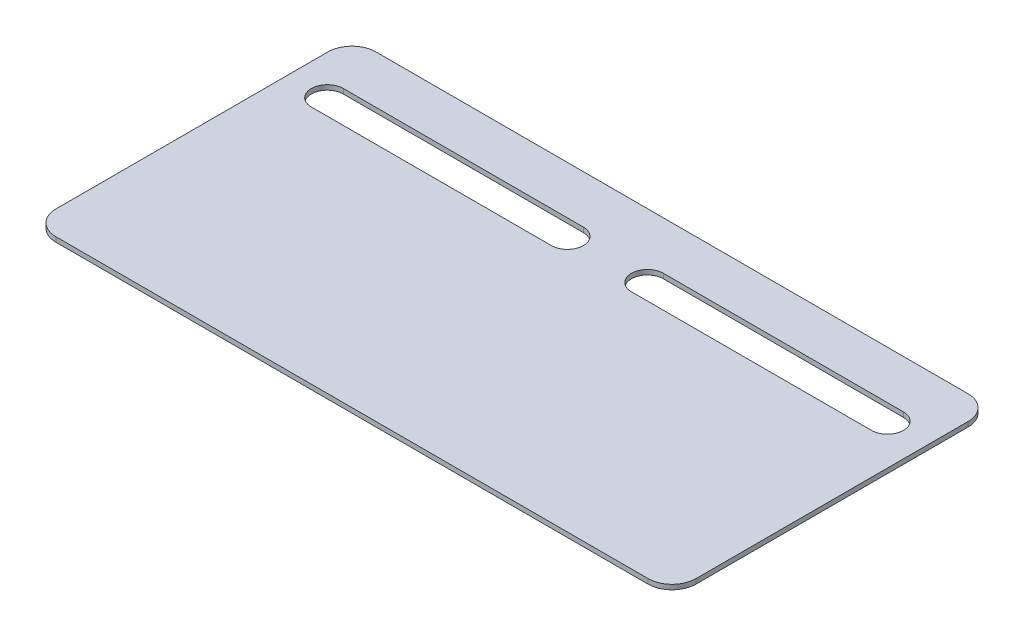
ISO-10303-21;
HEADER;
FILE_DESCRIPTION(('STEP AP214'),'2;1');
FILE_NAME('part.step','',(''),(''),'','','');
FILE_SCHEMA(('AUTOMOTIVE_DESIGN { 1 0 10303 214 1 1 1 1 }'));
ENDSEC;
DATA;
#1=APPLICATION_CONTEXT('core data for automotive mechanical design processes');
#2=APPLICATION_PROTOCOL_DEFINITION('international standard','automotive_design',2000,#1);
#3=PRODUCT_CONTEXT('',#1,'mechanical');
#4=PRODUCT('Part','Part','',(#3));
#5=PRODUCT_RELATED_PRODUCT_CATEGORY('part','',(#4));
#6=PRODUCT_DEFINITION_FORMATION('','',#4);
#7=PRODUCT_DEFINITION_CONTEXT('part definition',#1,'design');
#8=PRODUCT_DEFINITION('design','',#6,#7);
#9=PRODUCT_DEFINITION_SHAPE('','',#8);
#10=(LENGTH_UNIT() NAMED_UNIT(*) SI_UNIT(.MILLI.,.METRE.));
#11=(NAMED_UNIT(*) PLANE_ANGLE_UNIT() SI_UNIT($,.RADIAN.));
#12=(NAMED_UNIT(*) SI_UNIT($,.STERADIAN.) SOLID_ANGLE_UNIT());
#13=UNCERTAINTY_MEASURE_WITH_UNIT(LENGTH_MEASURE(1.E-05),#10,'distance_accuracy_value','');
#14=(GEOMETRIC_REPRESENTATION_CONTEXT(3) GLOBAL_UNCERTAINTY_ASSIGNED_CONTEXT((#13)) GLOBAL_UNIT_ASSIGNED_CONTEXT((#10,
#11,#12)) REPRESENTATION_CONTEXT('',''));
#15=CARTESIAN_POINT('',(0.,0.,0.));
#16=DIRECTION('',(0.,0.,1.));
#17=DIRECTION('',(1.,0.,0.));
#18=AXIS2_PLACEMENT_3D('',#15,#16,#17);
#19=CARTESIAN_POINT('',(185.384256148025,3.,-85.));
#20=DIRECTION('',(0.,-1.,0.));
#21=DIRECTION('',(0.,0.,-1.));
#22=AXIS2_PLACEMENT_3D('',#19,#20,#21);
#23=CYLINDRICAL_SURFACE('',#22,15.);
#24=CARTESIAN_POINT('',(185.384256148025,0.,-85.));
#25=DIRECTION('',(0.,1.,0.));
#26=DIRECTION('',(0.,0.,-1.));
#27=AXIS2_PLACEMENT_3D('',#24,#25,#26);
#28=CIRCLE('',#27,15.);
#29=CARTESIAN_POINT('',(200.384256148025,0.,-85.));
#30=VERTEX_POINT('',#29);
#31=CARTESIAN_POINT('',(185.384256148025,0.,-100.));
#32=VERTEX_POINT('',#31);
#33=EDGE_CURVE('E182',#30,#32,#28,.T.);
#34=ORIENTED_EDGE('',*,*,#33,.T.);
#35=DIRECTION('',(0.,-1.,0.));
#36=VECTOR('',#35,1.);
#37=CARTESIAN_POINT('',(185.384256148025,3.,-100.));
#38=LINE('',#37,#36);
#39=CARTESIAN_POINT('',(185.384256148025,3.,-100.));
#40=VERTEX_POINT('',#39);
#41=EDGE_CURVE('E11',#40,#32,#38,.T.);
#42=ORIENTED_EDGE('',*,*,#41,.F.);
#43=CARTESIAN_POINT('',(185.384256148025,3.,-85.));
#44=DIRECTION('',(0.,1.,0.));
#45=DIRECTION('',(0.,0.,-1.));
#46=AXIS2_PLACEMENT_3D('',#43,#44,#45);
#47=CIRCLE('',#46,15.);
#48=CARTESIAN_POINT('',(200.384256148025,3.,-85.));
#49=VERTEX_POINT('',#48);
#50=EDGE_CURVE('E215',#49,#40,#47,.T.);
#51=ORIENTED_EDGE('',*,*,#50,.F.);
#52=DIRECTION('',(0.,-1.,0.));
#53=VECTOR('',#52,1.);
#54=CARTESIAN_POINT('',(200.384256148025,3.,-85.));
#55=LINE('',#54,#53);
#56=EDGE_CURVE('E233',#49,#30,#55,.T.);
#57=ORIENTED_EDGE('',*,*,#56,.T.);
#58=EDGE_LOOP('',(#34,#42,#51,#57));
#59=FACE_BOUND('',#58,.T.);
#60=ADVANCED_FACE('F33',(#59),#23,.T.);
#61=CARTESIAN_POINT('',(-184.615743851975,3.,-100.));
#62=DIRECTION('',(0.,0.,1.));
#63=DIRECTION('',(1.,0.,0.));
#64=AXIS2_PLACEMENT_3D('',#61,#62,#63);
#65=PLANE('',#64);
#66=DIRECTION('',(-1.,0.,0.));
#67=VECTOR('',#66,1.);
#68=CARTESIAN_POINT('',(-184.615743851975,0.,-100.));
#69=LINE('',#68,#67);
#70=CARTESIAN_POINT('',(-184.615743851975,0.,-100.));
#71=VERTEX_POINT('',#70);
#72=EDGE_CURVE('E236',#32,#71,#69,.T.);
#73=ORIENTED_EDGE('',*,*,#72,.T.);
#74=DIRECTION('',(0.,-1.,0.));
#75=VECTOR('',#74,1.);
#76=CARTESIAN_POINT('',(-184.615743851975,3.,-100.));
#77=LINE('',#76,#75);
#78=CARTESIAN_POINT('',(-184.615743851975,3.,-100.));
#79=VERTEX_POINT('',#78);
#80=EDGE_CURVE('E40',#79,#71,#77,.T.);
#81=ORIENTED_EDGE('',*,*,#80,.F.);
#82=DIRECTION('',(-1.,0.,0.));
#83=VECTOR('',#82,1.);
#84=CARTESIAN_POINT('',(-184.615743851975,3.,-100.));
#85=LINE('',#84,#83);
#86=EDGE_CURVE('E218',#40,#79,#85,.T.);
#87=ORIENTED_EDGE('',*,*,#86,.F.);
#88=ORIENTED_EDGE('',*,*,#41,.T.);
#89=EDGE_LOOP('',(#73,#81,#87,#88));
#90=FACE_BOUND('',#89,.T.);
#91=ADVANCED_FACE('F292',(#90),#65,.F.);
#92=CARTESIAN_POINT('',(-184.615743851975,3.,-85.));
#93=DIRECTION('',(0.,-1.,0.));
#94=DIRECTION('',(0.,0.,-1.));
#95=AXIS2_PLACEMENT_3D('',#92,#93,#94);
#96=CYLINDRICAL_SURFACE('',#95,15.);
#97=CARTESIAN_POINT('',(-184.615743851975,0.,-85.));
#98=DIRECTION('',(0.,1.,0.));
#99=DIRECTION('',(0.,0.,1.));
#100=AXIS2_PLACEMENT_3D('',#97,#98,#99);
#101=CIRCLE('',#100,15.);
#102=CARTESIAN_POINT('',(-199.615743851975,0.,-85.));
#103=VERTEX_POINT('',#102);
#104=EDGE_CURVE('E238',#71,#103,#101,.T.);
#105=ORIENTED_EDGE('',*,*,#104,.T.);
#106=DIRECTION('',(0.,-1.,0.));
#107=VECTOR('',#106,1.);
#108=CARTESIAN_POINT('',(-199.615743851975,3.,-85.));
#109=LINE('',#108,#107);
#110=CARTESIAN_POINT('',(-199.615743851975,3.,-85.));
#111=VERTEX_POINT('',#110);
#112=EDGE_CURVE('E263',#111,#103,#109,.T.);
#113=ORIENTED_EDGE('',*,*,#112,.F.);
#114=CARTESIAN_POINT('',(-184.615743851975,3.,-85.));
#115=DIRECTION('',(0.,1.,0.));
#116=DIRECTION('',(0.,0.,1.));
#117=AXIS2_PLACEMENT_3D('',#114,#115,#116);
#118=CIRCLE('',#117,15.);
#119=EDGE_CURVE('E221',#79,#111,#118,.T.);
#120=ORIENTED_EDGE('',*,*,#119,.F.);
#121=ORIENTED_EDGE('',*,*,#80,.T.);
#122=EDGE_LOOP('',(#105,#113,#120,#121));
#123=FACE_BOUND('',#122,.T.);
#124=ADVANCED_FACE('F270',(#123),#96,.T.);
#125=CARTESIAN_POINT('',(-199.615743851975,3.,-85.));
#126=DIRECTION('',(1.,0.,0.));
#127=DIRECTION('',(0.,0.,-1.));
#128=AXIS2_PLACEMENT_3D('',#125,#126,#127);
#129=PLANE('',#128);
#130=DIRECTION('',(0.,0.,1.));
#131=VECTOR('',#130,1.);
#132=CARTESIAN_POINT('',(-199.615743851975,0.,-85.));
#133=LINE('',#132,#131);
#134=CARTESIAN_POINT('',(-199.615743851975,0.,85.));
#135=VERTEX_POINT('',#134);
#136=EDGE_CURVE('E240',#103,#135,#133,.T.);
#137=ORIENTED_EDGE('',*,*,#136,.T.);
#138=DIRECTION('',(0.,-1.,0.));
#139=VECTOR('',#138,1.);
#140=CARTESIAN_POINT('',(-199.615743851975,3.,85.));
#141=LINE('',#140,#139);
#142=CARTESIAN_POINT('',(-199.615743851975,3.,85.));
#143=VERTEX_POINT('',#142);
#144=EDGE_CURVE('E260',#143,#135,#141,.T.);
#145=ORIENTED_EDGE('',*,*,#144,.F.);
#146=DIRECTION('',(0.,0.,1.));
#147=VECTOR('',#146,1.);
#148=CARTESIAN_POINT('',(-199.615743851975,3.,-85.));
#149=LINE('',#148,#147);
#150=EDGE_CURVE('E223',#111,#143,#149,.T.);
#151=ORIENTED_EDGE('',*,*,#150,.F.);
#152=ORIENTED_EDGE('',*,*,#112,.T.);
#153=EDGE_LOOP('',(#137,#145,#151,#152));
#154=FACE_BOUND('',#153,.T.);
#155=ADVANCED_FACE('F280',(#154),#129,.F.);
#156=CARTESIAN_POINT('',(-184.615743851975,3.,85.));
#157=DIRECTION('',(0.,-1.,0.));
#158=DIRECTION('',(0.,0.,-1.));
#159=AXIS2_PLACEMENT_3D('',#156,#157,#158);
#160=CYLINDRICAL_SURFACE('',#159,15.);
#161=CARTESIAN_POINT('',(-184.615743851975,0.,85.));
#162=DIRECTION('',(0.,1.,0.));
#163=DIRECTION('',(0.,0.,1.));
#164=AXIS2_PLACEMENT_3D('',#161,#162,#163);
#165=CIRCLE('',#164,15.);
#166=CARTESIAN_POINT('',(-184.615743851975,0.,100.));
#167=VERTEX_POINT('',#166);
#168=EDGE_CURVE('E242',#135,#167,#165,.T.);
#169=ORIENTED_EDGE('',*,*,#168,.T.);
#170=DIRECTION('',(0.,-1.,0.));
#171=VECTOR('',#170,1.);
#172=CARTESIAN_POINT('',(-184.615743851975,3.,100.));
#173=LINE('',#172,#171);
#174=CARTESIAN_POINT('',(-184.615743851975,3.,100.));
#175=VERTEX_POINT('',#174);
#176=EDGE_CURVE('E257',#175,#167,#173,.T.);
#177=ORIENTED_EDGE('',*,*,#176,.F.);
#178=CARTESIAN_POINT('',(-184.615743851975,3.,85.));
#179=DIRECTION('',(0.,1.,0.));
#180=DIRECTION('',(0.,0.,1.));
#181=AXIS2_PLACEMENT_3D('',#178,#179,#180);
#182=CIRCLE('',#181,15.);
#183=EDGE_CURVE('E225',#143,#175,#182,.T.);
#184=ORIENTED_EDGE('',*,*,#183,.F.);
#185=ORIENTED_EDGE('',*,*,#144,.T.);
#186=EDGE_LOOP('',(#169,#177,#184,#185));
#187=FACE_BOUND('',#186,.T.);
#188=ADVANCED_FACE('F284',(#187),#160,.T.);
#189=CARTESIAN_POINT('',(-184.615743851975,3.,100.));
#190=DIRECTION('',(0.,0.,-1.));
#191=DIRECTION('',(-1.,0.,0.));
#192=AXIS2_PLACEMENT_3D('',#189,#190,#191);
#193=PLANE('',#192);
#194=DIRECTION('',(1.,0.,0.));
#195=VECTOR('',#194,1.);
#196=CARTESIAN_POINT('',(-184.615743851975,0.,100.));
#197=LINE('',#196,#195);
#198=CARTESIAN_POINT('',(185.384256148025,0.,100.));
#199=VERTEX_POINT('',#198);
#200=EDGE_CURVE('E244',#167,#199,#197,.T.);
#201=ORIENTED_EDGE('',*,*,#200,.T.);
#202=DIRECTION('',(0.,-1.,0.));
#203=VECTOR('',#202,1.);
#204=CARTESIAN_POINT('',(185.384256148025,3.,100.));
#205=LINE('',#204,#203);
#206=CARTESIAN_POINT('',(185.384256148025,3.,100.));
#207=VERTEX_POINT('',#206);
#208=EDGE_CURVE('E254',#207,#199,#205,.T.);
#209=ORIENTED_EDGE('',*,*,#208,.F.);
#210=DIRECTION('',(1.,0.,0.));
#211=VECTOR('',#210,1.);
#212=CARTESIAN_POINT('',(-184.615743851975,3.,100.));
#213=LINE('',#212,#211);
#214=EDGE_CURVE('E227',#175,#207,#213,.T.);
#215=ORIENTED_EDGE('',*,*,#214,.F.);
#216=ORIENTED_EDGE('',*,*,#176,.T.);
#217=EDGE_LOOP('',(#201,#209,#215,#216));
#218=FACE_BOUND('',#217,.T.);
#219=ADVANCED_FACE('F305',(#218),#193,.F.);
#220=CARTESIAN_POINT('',(185.384256148025,3.,85.));
#221=DIRECTION('',(0.,-1.,0.));
#222=DIRECTION('',(0.,0.,-1.));
#223=AXIS2_PLACEMENT_3D('',#220,#221,#222);
#224=CYLINDRICAL_SURFACE('',#223,15.);
#225=CARTESIAN_POINT('',(185.384256148025,0.,85.));
#226=DIRECTION('',(0.,1.,0.));
#227=DIRECTION('',(0.,0.,1.));
#228=AXIS2_PLACEMENT_3D('',#225,#226,#227);
#229=CIRCLE('',#228,15.);
#230=CARTESIAN_POINT('',(200.384256148025,0.,85.));
#231=VERTEX_POINT('',#230);
#232=EDGE_CURVE('E246',#199,#231,#229,.T.);
#233=ORIENTED_EDGE('',*,*,#232,.T.);
#234=DIRECTION('',(0.,-1.,0.));
#235=VECTOR('',#234,1.);
#236=CARTESIAN_POINT('',(200.384256148025,3.,85.));
#237=LINE('',#236,#235);
#238=CARTESIAN_POINT('',(200.384256148025,3.,85.));
#239=VERTEX_POINT('',#238);
#240=EDGE_CURVE('E251',#239,#231,#237,.T.);
#241=ORIENTED_EDGE('',*,*,#240,.F.);
#242=CARTESIAN_POINT('',(185.384256148025,3.,85.));
#243=DIRECTION('',(0.,1.,0.));
#244=DIRECTION('',(0.,0.,1.));
#245=AXIS2_PLACEMENT_3D('',#242,#243,#244);
#246=CIRCLE('',#245,15.);
#247=EDGE_CURVE('E229',#207,#239,#246,.T.);
#248=ORIENTED_EDGE('',*,*,#247,.F.);
#249=ORIENTED_EDGE('',*,*,#208,.T.);
#250=EDGE_LOOP('',(#233,#241,#248,#249));
#251=FACE_BOUND('',#250,.T.);
#252=ADVANCED_FACE('F303',(#251),#224,.T.);
#253=CARTESIAN_POINT('',(200.384256148025,3.,-85.));
#254=DIRECTION('',(-1.,0.,0.));
#255=DIRECTION('',(0.,0.,1.));
#256=AXIS2_PLACEMENT_3D('',#253,#254,#255);
#257=PLANE('',#256);
#258=DIRECTION('',(0.,0.,-1.));
#259=VECTOR('',#258,1.);
#260=CARTESIAN_POINT('',(200.384256148025,0.,-85.));
#261=LINE('',#260,#259);
#262=EDGE_CURVE('E219',#231,#30,#261,.T.);
#263=ORIENTED_EDGE('',*,*,#262,.T.);
#264=ORIENTED_EDGE('',*,*,#56,.F.);
#265=DIRECTION('',(0.,0.,-1.));
#266=VECTOR('',#265,1.);
#267=CARTESIAN_POINT('',(200.384256148025,3.,-85.));
#268=LINE('',#267,#266);
#269=EDGE_CURVE('E231',#239,#49,#268,.T.);
#270=ORIENTED_EDGE('',*,*,#269,.F.);
#271=ORIENTED_EDGE('',*,*,#240,.T.);
#272=EDGE_LOOP('',(#263,#264,#270,#271));
#273=FACE_BOUND('',#272,.T.);
#274=ADVANCED_FACE('F298',(#273),#257,.F.);
#275=CARTESIAN_POINT('',(185.384256148025,3.,-85.));
#276=DIRECTION('',(0.,-1.,0.));
#277=DIRECTION('',(0.,0.,-1.));
#278=AXIS2_PLACEMENT_3D('',#275,#276,#277);
#279=PLANE('',#278);
#280=DIRECTION('',(1.,0.,0.));
#281=VECTOR('',#280,1.);
#282=CARTESIAN_POINT('',(-175.,3.,-50.));
#283=LINE('',#282,#281);
#284=CARTESIAN_POINT('',(-175.,3.,-50.));
#285=VERTEX_POINT('',#284);
#286=CARTESIAN_POINT('',(-25.,3.,-50.));
#287=VERTEX_POINT('',#286);
#288=EDGE_CURVE('E175',#285,#287,#283,.T.);
#289=ORIENTED_EDGE('',*,*,#288,.F.);
#290=CARTESIAN_POINT('',(-175.,3.,-60.));
#291=DIRECTION('',(0.,1.,0.));
#292=DIRECTION('',(0.,0.,1.));
#293=AXIS2_PLACEMENT_3D('',#290,#291,#292);
#294=CIRCLE('',#293,10.);
#295=CARTESIAN_POINT('',(-175.,3.,-70.));
#296=VERTEX_POINT('',#295);
#297=EDGE_CURVE('E47',#296,#285,#294,.T.);
#298=ORIENTED_EDGE('',*,*,#297,.F.);
#299=DIRECTION('',(-1.,0.,0.));
#300=VECTOR('',#299,1.);
#301=CARTESIAN_POINT('',(-175.,3.,-70.));
#302=LINE('',#301,#300);
#303=CARTESIAN_POINT('',(-25.,3.,-70.));
#304=VERTEX_POINT('',#303);
#305=EDGE_CURVE('E166',#304,#296,#302,.T.);
#306=ORIENTED_EDGE('',*,*,#305,.F.);
#307=CARTESIAN_POINT('',(-25.,3.,-60.));
#308=DIRECTION('',(0.,1.,0.));
#309=DIRECTION('',(0.,0.,1.));
#310=AXIS2_PLACEMENT_3D('',#307,#308,#309);
#311=CIRCLE('',#310,10.);
#312=EDGE_CURVE('E169',#287,#304,#311,.T.);
#313=ORIENTED_EDGE('',*,*,#312,.F.);
#314=EDGE_LOOP('',(#289,#298,#306,#313));
#315=FACE_BOUND('',#314,.T.);
#316=DIRECTION('',(1.,0.,0.));
#317=VECTOR('',#316,1.);
#318=CARTESIAN_POINT('',(25.,3.,-50.));
#319=LINE('',#318,#317);
#320=CARTESIAN_POINT('',(25.,3.,-50.));
#321=VERTEX_POINT('',#320);
#322=CARTESIAN_POINT('',(175.,3.,-50.));
#323=VERTEX_POINT('',#322);
#324=EDGE_CURVE('E201',#321,#323,#319,.T.);
#325=ORIENTED_EDGE('',*,*,#324,.F.);
#326=CARTESIAN_POINT('',(25.,3.,-60.));
#327=DIRECTION('',(0.,1.,0.));
#328=DIRECTION('',(0.,0.,1.));
#329=AXIS2_PLACEMENT_3D('',#326,#327,#328);
#330=CIRCLE('',#329,10.);
#331=CARTESIAN_POINT('',(25.,3.,-70.));
#332=VERTEX_POINT('',#331);
#333=EDGE_CURVE('E55',#332,#321,#330,.T.);
#334=ORIENTED_EDGE('',*,*,#333,.F.);
#335=DIRECTION('',(-1.,0.,0.));
#336=VECTOR('',#335,1.);
#337=CARTESIAN_POINT('',(25.,3.,-70.));
#338=LINE('',#337,#336);
#339=CARTESIAN_POINT('',(175.,3.,-70.));
#340=VERTEX_POINT('',#339);
#341=EDGE_CURVE('E190',#340,#332,#338,.T.);
#342=ORIENTED_EDGE('',*,*,#341,.F.);
#343=CARTESIAN_POINT('',(175.,3.,-60.));
#344=DIRECTION('',(0.,1.,0.));
#345=DIRECTION('',(0.,0.,1.));
#346=AXIS2_PLACEMENT_3D('',#343,#344,#345);
#347=CIRCLE('',#346,10.);
#348=EDGE_CURVE('E204',#323,#340,#347,.T.);
#349=ORIENTED_EDGE('',*,*,#348,.F.);
#350=EDGE_LOOP('',(#325,#334,#342,#349));
#351=FACE_BOUND('',#350,.T.);
#352=ORIENTED_EDGE('',*,*,#50,.T.);
#353=ORIENTED_EDGE('',*,*,#86,.T.);
#354=ORIENTED_EDGE('',*,*,#119,.T.);
#355=ORIENTED_EDGE('',*,*,#150,.T.);
#356=ORIENTED_EDGE('',*,*,#183,.T.);
#357=ORIENTED_EDGE('',*,*,#214,.T.);
#358=ORIENTED_EDGE('',*,*,#247,.T.);
#359=ORIENTED_EDGE('',*,*,#269,.T.);
#360=EDGE_LOOP('',(#352,#353,#354,#355,#356,#357,#358,#359));
#361=FACE_BOUND('',#360,.T.);
#362=ADVANCED_FACE('F288',(#315,#351,#361),#279,.F.);
#363=CARTESIAN_POINT('',(185.384256148025,0.,-85.));
#364=DIRECTION('',(0.,-1.,0.));
#365=DIRECTION('',(0.,0.,-1.));
#366=AXIS2_PLACEMENT_3D('',#363,#364,#365);
#367=PLANE('',#366);
#368=CARTESIAN_POINT('',(-175.,0.,-60.));
#369=DIRECTION('',(0.,1.,0.));
#370=DIRECTION('',(0.,0.,1.));
#371=AXIS2_PLACEMENT_3D('',#368,#369,#370);
#372=CIRCLE('',#371,10.);
#373=CARTESIAN_POINT('',(-175.,0.,-70.));
#374=VERTEX_POINT('',#373);
#375=CARTESIAN_POINT('',(-175.,0.,-50.));
#376=VERTEX_POINT('',#375);
#377=EDGE_CURVE('E147',#374,#376,#372,.T.);
#378=ORIENTED_EDGE('',*,*,#377,.T.);
#379=DIRECTION('',(1.,0.,0.));
#380=VECTOR('',#379,1.);
#381=CARTESIAN_POINT('',(-175.,0.,-50.));
#382=LINE('',#381,#380);
#383=CARTESIAN_POINT('',(-25.,0.,-50.));
#384=VERTEX_POINT('',#383);
#385=EDGE_CURVE('E157',#376,#384,#382,.T.);
#386=ORIENTED_EDGE('',*,*,#385,.T.);
#387=CARTESIAN_POINT('',(-25.,0.,-60.));
#388=DIRECTION('',(0.,1.,0.));
#389=DIRECTION('',(0.,0.,1.));
#390=AXIS2_PLACEMENT_3D('',#387,#388,#389);
#391=CIRCLE('',#390,10.);
#392=CARTESIAN_POINT('',(-25.,0.,-70.));
#393=VERTEX_POINT('',#392);
#394=EDGE_CURVE('E161',#384,#393,#391,.T.);
#395=ORIENTED_EDGE('',*,*,#394,.T.);
#396=DIRECTION('',(-1.,0.,0.));
#397=VECTOR('',#396,1.);
#398=CARTESIAN_POINT('',(-175.,0.,-70.));
#399=LINE('',#398,#397);
#400=EDGE_CURVE('E153',#393,#374,#399,.T.);
#401=ORIENTED_EDGE('',*,*,#400,.T.);
#402=EDGE_LOOP('',(#378,#386,#395,#401));
#403=FACE_BOUND('',#402,.T.);
#404=CARTESIAN_POINT('',(25.,0.,-60.));
#405=DIRECTION('',(0.,1.,0.));
#406=DIRECTION('',(0.,0.,1.));
#407=AXIS2_PLACEMENT_3D('',#404,#405,#406);
#408=CIRCLE('',#407,10.);
#409=CARTESIAN_POINT('',(25.,0.,-70.));
#410=VERTEX_POINT('',#409);
#411=CARTESIAN_POINT('',(25.,0.,-50.));
#412=VERTEX_POINT('',#411);
#413=EDGE_CURVE('E186',#410,#412,#408,.T.);
#414=ORIENTED_EDGE('',*,*,#413,.T.);
#415=DIRECTION('',(1.,0.,0.));
#416=VECTOR('',#415,1.);
#417=CARTESIAN_POINT('',(25.,0.,-50.));
#418=LINE('',#417,#416);
#419=CARTESIAN_POINT('',(175.,0.,-50.));
#420=VERTEX_POINT('',#419);
#421=EDGE_CURVE('E189',#412,#420,#418,.T.);
#422=ORIENTED_EDGE('',*,*,#421,.T.);
#423=CARTESIAN_POINT('',(175.,0.,-60.));
#424=DIRECTION('',(0.,1.,0.));
#425=DIRECTION('',(0.,0.,1.));
#426=AXIS2_PLACEMENT_3D('',#423,#424,#425);
#427=CIRCLE('',#426,10.);
#428=CARTESIAN_POINT('',(175.,0.,-70.));
#429=VERTEX_POINT('',#428);
#430=EDGE_CURVE('E193',#420,#429,#427,.T.);
#431=ORIENTED_EDGE('',*,*,#430,.T.);
#432=DIRECTION('',(-1.,0.,0.));
#433=VECTOR('',#432,1.);
#434=CARTESIAN_POINT('',(25.,0.,-70.));
#435=LINE('',#434,#433);
#436=EDGE_CURVE('E196',#429,#410,#435,.T.);
#437=ORIENTED_EDGE('',*,*,#436,.T.);
#438=EDGE_LOOP('',(#414,#422,#431,#437));
#439=FACE_BOUND('',#438,.T.);
#440=ORIENTED_EDGE('',*,*,#33,.F.);
#441=ORIENTED_EDGE('',*,*,#262,.F.);
#442=ORIENTED_EDGE('',*,*,#232,.F.);
#443=ORIENTED_EDGE('',*,*,#200,.F.);
#444=ORIENTED_EDGE('',*,*,#168,.F.);
#445=ORIENTED_EDGE('',*,*,#136,.F.);
#446=ORIENTED_EDGE('',*,*,#104,.F.);
#447=ORIENTED_EDGE('',*,*,#72,.F.);
#448=EDGE_LOOP('',(#440,#441,#442,#443,#444,#445,#446,#447));
#449=FACE_BOUND('',#448,.T.);
#450=ADVANCED_FACE('F163',(#403,#439,#449),#367,.T.);
#451=CARTESIAN_POINT('',(25.,0.,-60.));
#452=DIRECTION('',(0.,1.,0.));
#453=DIRECTION('',(0.,0.,1.));
#454=AXIS2_PLACEMENT_3D('',#451,#452,#453);
#455=CYLINDRICAL_SURFACE('',#454,10.);
#456=ORIENTED_EDGE('',*,*,#333,.T.);
#457=DIRECTION('',(0.,1.,0.));
#458=VECTOR('',#457,1.);
#459=CARTESIAN_POINT('',(25.,0.,-50.));
#460=LINE('',#459,#458);
#461=EDGE_CURVE('E199',#412,#321,#460,.T.);
#462=ORIENTED_EDGE('',*,*,#461,.F.);
#463=ORIENTED_EDGE('',*,*,#413,.F.);
#464=DIRECTION('',(0.,1.,0.));
#465=VECTOR('',#464,1.);
#466=CARTESIAN_POINT('',(25.,0.,-70.));
#467=LINE('',#466,#465);
#468=EDGE_CURVE('E176',#410,#332,#467,.T.);
#469=ORIENTED_EDGE('',*,*,#468,.T.);
#470=EDGE_LOOP('',(#456,#462,#463,#469));
#471=FACE_BOUND('',#470,.T.);
#472=ADVANCED_FACE('F368',(#471),#455,.F.);
#473=CARTESIAN_POINT('',(25.,0.,-70.));
#474=DIRECTION('',(0.,0.,-1.));
#475=DIRECTION('',(-1.,0.,0.));
#476=AXIS2_PLACEMENT_3D('',#473,#474,#475);
#477=PLANE('',#476);
#478=ORIENTED_EDGE('',*,*,#341,.T.);
#479=ORIENTED_EDGE('',*,*,#468,.F.);
#480=ORIENTED_EDGE('',*,*,#436,.F.);
#481=DIRECTION('',(0.,1.,0.));
#482=VECTOR('',#481,1.);
#483=CARTESIAN_POINT('',(175.,0.,-70.));
#484=LINE('',#483,#482);
#485=EDGE_CURVE('E210',#429,#340,#484,.T.);
#486=ORIENTED_EDGE('',*,*,#485,.T.);
#487=EDGE_LOOP('',(#478,#479,#480,#486));
#488=FACE_BOUND('',#487,.T.);
#489=ADVANCED_FACE('F377',(#488),#477,.F.);
#490=CARTESIAN_POINT('',(175.,0.,-60.));
#491=DIRECTION('',(0.,1.,0.));
#492=DIRECTION('',(0.,0.,1.));
#493=AXIS2_PLACEMENT_3D('',#490,#491,#492);
#494=CYLINDRICAL_SURFACE('',#493,10.);
#495=ORIENTED_EDGE('',*,*,#348,.T.);
#496=ORIENTED_EDGE('',*,*,#485,.F.);
#497=ORIENTED_EDGE('',*,*,#430,.F.);
#498=DIRECTION('',(0.,1.,0.));
#499=VECTOR('',#498,1.);
#500=CARTESIAN_POINT('',(175.,0.,-50.));
#501=LINE('',#500,#499);
#502=EDGE_CURVE('E212',#420,#323,#501,.T.);
#503=ORIENTED_EDGE('',*,*,#502,.T.);
#504=EDGE_LOOP('',(#495,#496,#497,#503));
#505=FACE_BOUND('',#504,.T.);
#506=ADVANCED_FACE('F386',(#505),#494,.F.);
#507=CARTESIAN_POINT('',(25.,0.,-50.));
#508=DIRECTION('',(0.,0.,1.));
#509=DIRECTION('',(1.,0.,0.));
#510=AXIS2_PLACEMENT_3D('',#507,#508,#509);
#511=PLANE('',#510);
#512=ORIENTED_EDGE('',*,*,#324,.T.);
#513=ORIENTED_EDGE('',*,*,#502,.F.);
#514=ORIENTED_EDGE('',*,*,#421,.F.);
#515=ORIENTED_EDGE('',*,*,#461,.T.);
#516=EDGE_LOOP('',(#512,#513,#514,#515));
#517=FACE_BOUND('',#516,.T.);
#518=ADVANCED_FACE('F396',(#517),#511,.F.);
#519=CARTESIAN_POINT('',(-175.,0.,-60.));
#520=DIRECTION('',(0.,1.,0.));
#521=DIRECTION('',(0.,0.,1.));
#522=AXIS2_PLACEMENT_3D('',#519,#520,#521);
#523=CYLINDRICAL_SURFACE('',#522,10.);
#524=ORIENTED_EDGE('',*,*,#297,.T.);
#525=DIRECTION('',(0.,1.,0.));
#526=VECTOR('',#525,1.);
#527=CARTESIAN_POINT('',(-175.,0.,-50.));
#528=LINE('',#527,#526);
#529=EDGE_CURVE('E143',#376,#285,#528,.T.);
#530=ORIENTED_EDGE('',*,*,#529,.F.);
#531=ORIENTED_EDGE('',*,*,#377,.F.);
#532=DIRECTION('',(0.,1.,0.));
#533=VECTOR('',#532,1.);
#534=CARTESIAN_POINT('',(-175.,0.,-70.));
#535=LINE('',#534,#533);
#536=EDGE_CURVE('E180',#374,#296,#535,.T.);
#537=ORIENTED_EDGE('',*,*,#536,.T.);
#538=EDGE_LOOP('',(#524,#530,#531,#537));
#539=FACE_BOUND('',#538,.T.);
#540=ADVANCED_FACE('F145',(#539),#523,.F.);
#541=CARTESIAN_POINT('',(-175.,0.,-70.));
#542=DIRECTION('',(0.,0.,-1.));
#543=DIRECTION('',(-1.,0.,0.));
#544=AXIS2_PLACEMENT_3D('',#541,#542,#543);
#545=PLANE('',#544);
#546=ORIENTED_EDGE('',*,*,#305,.T.);
#547=ORIENTED_EDGE('',*,*,#536,.F.);
#548=ORIENTED_EDGE('',*,*,#400,.F.);
#549=DIRECTION('',(0.,1.,0.));
#550=VECTOR('',#549,1.);
#551=CARTESIAN_POINT('',(-25.,0.,-70.));
#552=LINE('',#551,#550);
#553=EDGE_CURVE('E183',#393,#304,#552,.T.);
#554=ORIENTED_EDGE('',*,*,#553,.T.);
#555=EDGE_LOOP('',(#546,#547,#548,#554));
#556=FACE_BOUND('',#555,.T.);
#557=ADVANCED_FACE('F415',(#556),#545,.F.);
#558=CARTESIAN_POINT('',(-25.,0.,-60.));
#559=DIRECTION('',(0.,1.,0.));
#560=DIRECTION('',(0.,0.,1.));
#561=AXIS2_PLACEMENT_3D('',#558,#559,#560);
#562=CYLINDRICAL_SURFACE('',#561,10.);
#563=ORIENTED_EDGE('',*,*,#312,.T.);
#564=ORIENTED_EDGE('',*,*,#553,.F.);
#565=ORIENTED_EDGE('',*,*,#394,.F.);
#566=DIRECTION('',(0.,1.,0.));
#567=VECTOR('',#566,1.);
#568=CARTESIAN_POINT('',(-25.,0.,-50.));
#569=LINE('',#568,#567);
#570=EDGE_CURVE('E152',#384,#287,#569,.T.);
#571=ORIENTED_EDGE('',*,*,#570,.T.);
#572=EDGE_LOOP('',(#563,#564,#565,#571));
#573=FACE_BOUND('',#572,.T.);
#574=ADVANCED_FACE('F424',(#573),#562,.F.);
#575=CARTESIAN_POINT('',(-175.,0.,-50.));
#576=DIRECTION('',(0.,0.,1.));
#577=DIRECTION('',(1.,0.,0.));
#578=AXIS2_PLACEMENT_3D('',#575,#576,#577);
#579=PLANE('',#578);
#580=ORIENTED_EDGE('',*,*,#288,.T.);
#581=ORIENTED_EDGE('',*,*,#570,.F.);
#582=ORIENTED_EDGE('',*,*,#385,.F.);
#583=ORIENTED_EDGE('',*,*,#529,.T.);
#584=EDGE_LOOP('',(#580,#581,#582,#583));
#585=FACE_BOUND('',#584,.T.);
#586=ADVANCED_FACE('F158',(#585),#579,.F.);
#587=CLOSED_SHELL('',(#60,#91,#124,#155,#188,#219,#252,#274,#362,#450,#472,#489,#506,#518,#540,
#557,#574,#586));
#588=MANIFOLD_SOLID_BREP('B2',#587);
#589=ADVANCED_BREP_SHAPE_REPRESENTATION('',(#18,#588),#14);
#590=SHAPE_DEFINITION_REPRESENTATION(#9,#589);
ENDSEC;
END-ISO-10303-21;
